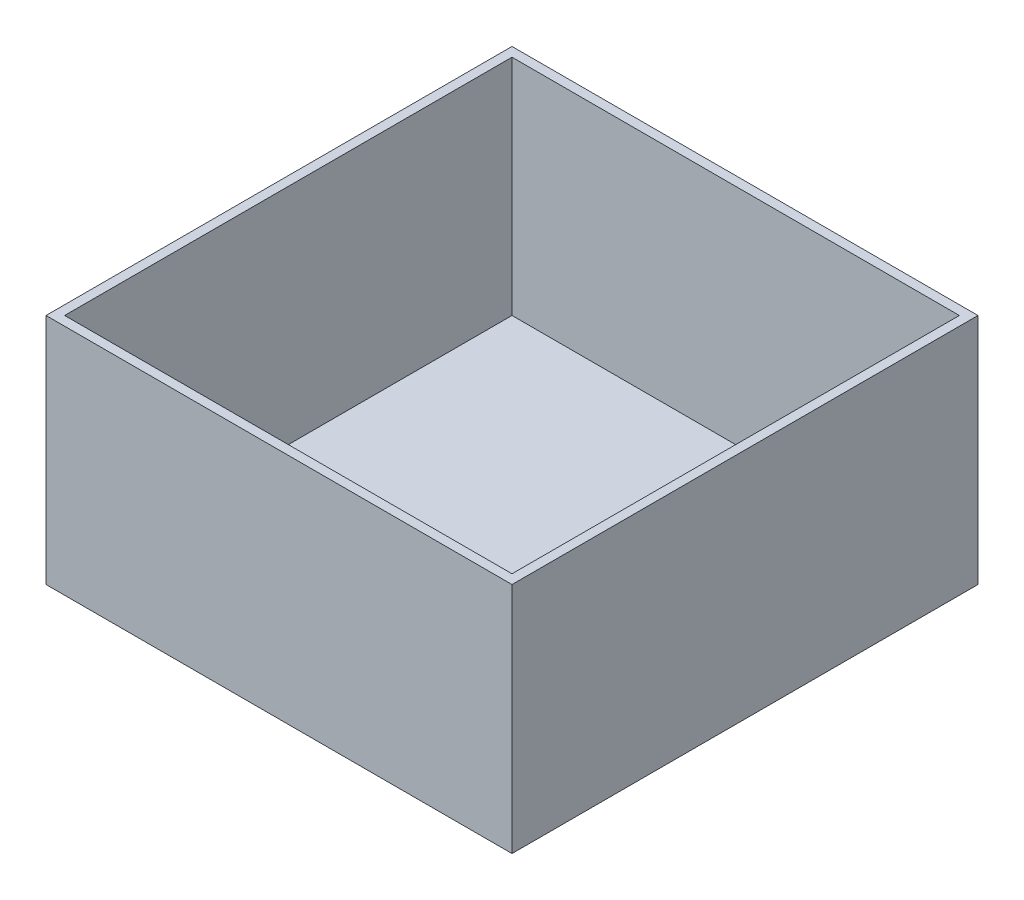
ISO-10303-21;
HEADER;
FILE_DESCRIPTION(('STEP AP214'),'2;1');
FILE_NAME('part.step','',(''),(''),'','','');
FILE_SCHEMA(('AUTOMOTIVE_DESIGN { 1 0 10303 214 1 1 1 1 }'));
ENDSEC;
DATA;
#1=APPLICATION_CONTEXT('core data for automotive mechanical design processes');
#2=APPLICATION_PROTOCOL_DEFINITION('international standard','automotive_design',2000,#1);
#3=PRODUCT_CONTEXT('',#1,'mechanical');
#4=PRODUCT('Part','Part','',(#3));
#5=PRODUCT_RELATED_PRODUCT_CATEGORY('part','',(#4));
#6=PRODUCT_DEFINITION_FORMATION('','',#4);
#7=PRODUCT_DEFINITION_CONTEXT('part definition',#1,'design');
#8=PRODUCT_DEFINITION('design','',#6,#7);
#9=PRODUCT_DEFINITION_SHAPE('','',#8);
#10=(LENGTH_UNIT() NAMED_UNIT(*) SI_UNIT(.MILLI.,.METRE.));
#11=(NAMED_UNIT(*) PLANE_ANGLE_UNIT() SI_UNIT($,.RADIAN.));
#12=(NAMED_UNIT(*) SI_UNIT($,.STERADIAN.) SOLID_ANGLE_UNIT());
#13=UNCERTAINTY_MEASURE_WITH_UNIT(LENGTH_MEASURE(1.E-05),#10,'distance_accuracy_value','');
#14=(GEOMETRIC_REPRESENTATION_CONTEXT(3) GLOBAL_UNCERTAINTY_ASSIGNED_CONTEXT((#13)) GLOBAL_UNIT_ASSIGNED_CONTEXT((#10,
#11,#12)) REPRESENTATION_CONTEXT('',''));
#15=CARTESIAN_POINT('',(0.,0.,0.));
#16=DIRECTION('',(0.,0.,1.));
#17=DIRECTION('',(1.,0.,0.));
#18=AXIS2_PLACEMENT_3D('',#15,#16,#17);
#19=CARTESIAN_POINT('',(-145.919437275,250.,-401.338562297017));
#20=DIRECTION('',(1.,0.,0.));
#21=DIRECTION('',(0.,0.,-1.));
#22=AXIS2_PLACEMENT_3D('',#19,#20,#21);
#23=PLANE('',#22);
#24=DIRECTION('',(0.,0.,1.));
#25=VECTOR('',#24,1.);
#26=CARTESIAN_POINT('',(-145.919437275,0.,-401.338562297017));
#27=LINE('',#26,#25);
#28=CARTESIAN_POINT('',(-145.919437275,0.,-401.338562297017));
#29=VERTEX_POINT('',#28);
#30=CARTESIAN_POINT('',(-145.919437274999,0.,98.6614377029827));
#31=VERTEX_POINT('',#30);
#32=EDGE_CURVE('E155',#29,#31,#27,.T.);
#33=ORIENTED_EDGE('',*,*,#32,.T.);
#34=DIRECTION('',(0.,-1.,0.));
#35=VECTOR('',#34,1.);
#36=CARTESIAN_POINT('',(-145.919437274999,250.,98.6614377029827));
#37=LINE('',#36,#35);
#38=CARTESIAN_POINT('',(-145.919437274999,250.,98.6614377029827));
#39=VERTEX_POINT('',#38);
#40=EDGE_CURVE('E11',#39,#31,#37,.T.);
#41=ORIENTED_EDGE('',*,*,#40,.F.);
#42=DIRECTION('',(0.,0.,1.));
#43=VECTOR('',#42,1.);
#44=CARTESIAN_POINT('',(-145.919437275,250.,-401.338562297017));
#45=LINE('',#44,#43);
#46=CARTESIAN_POINT('',(-145.919437275,250.,-401.338562297017));
#47=VERTEX_POINT('',#46);
#48=EDGE_CURVE('E148',#47,#39,#45,.T.);
#49=ORIENTED_EDGE('',*,*,#48,.F.);
#50=DIRECTION('',(0.,-1.,0.));
#51=VECTOR('',#50,1.);
#52=CARTESIAN_POINT('',(-145.919437275,250.,-401.338562297017));
#53=LINE('',#52,#51);
#54=EDGE_CURVE('E154',#47,#29,#53,.T.);
#55=ORIENTED_EDGE('',*,*,#54,.T.);
#56=EDGE_LOOP('',(#33,#41,#49,#55));
#57=FACE_BOUND('',#56,.T.);
#58=ADVANCED_FACE('F41',(#57),#23,.F.);
#59=CARTESIAN_POINT('',(-145.919437274999,250.,98.6614377029827));
#60=DIRECTION('',(0.,0.,-1.));
#61=DIRECTION('',(-1.,0.,0.));
#62=AXIS2_PLACEMENT_3D('',#59,#60,#61);
#63=PLANE('',#62);
#64=DIRECTION('',(1.,0.,0.));
#65=VECTOR('',#64,1.);
#66=CARTESIAN_POINT('',(-145.919437274999,0.,98.6614377029827));
#67=LINE('',#66,#65);
#68=CARTESIAN_POINT('',(354.080562725001,0.,98.6614377029827));
#69=VERTEX_POINT('',#68);
#70=EDGE_CURVE('E158',#31,#69,#67,.T.);
#71=ORIENTED_EDGE('',*,*,#70,.T.);
#72=DIRECTION('',(0.,-1.,0.));
#73=VECTOR('',#72,1.);
#74=CARTESIAN_POINT('',(354.080562725001,250.,98.6614377029827));
#75=LINE('',#74,#73);
#76=CARTESIAN_POINT('',(354.080562725001,250.,98.6614377029827));
#77=VERTEX_POINT('',#76);
#78=EDGE_CURVE('E48',#77,#69,#75,.T.);
#79=ORIENTED_EDGE('',*,*,#78,.F.);
#80=DIRECTION('',(1.,0.,0.));
#81=VECTOR('',#80,1.);
#82=CARTESIAN_POINT('',(-145.919437274999,250.,98.6614377029827));
#83=LINE('',#82,#81);
#84=EDGE_CURVE('E92',#39,#77,#83,.T.);
#85=ORIENTED_EDGE('',*,*,#84,.F.);
#86=ORIENTED_EDGE('',*,*,#40,.T.);
#87=EDGE_LOOP('',(#71,#79,#85,#86));
#88=FACE_BOUND('',#87,.T.);
#89=ADVANCED_FACE('F187',(#88),#63,.F.);
#90=CARTESIAN_POINT('',(354.080562725001,250.,-401.338562297017));
#91=DIRECTION('',(-1.,0.,0.));
#92=DIRECTION('',(0.,0.,1.));
#93=AXIS2_PLACEMENT_3D('',#90,#91,#92);
#94=PLANE('',#93);
#95=DIRECTION('',(0.,0.,-1.));
#96=VECTOR('',#95,1.);
#97=CARTESIAN_POINT('',(354.080562725001,0.,-401.338562297017));
#98=LINE('',#97,#96);
#99=CARTESIAN_POINT('',(354.080562725001,0.,-401.338562297017));
#100=VERTEX_POINT('',#99);
#101=EDGE_CURVE('E160',#69,#100,#98,.T.);
#102=ORIENTED_EDGE('',*,*,#101,.T.);
#103=DIRECTION('',(0.,-1.,0.));
#104=VECTOR('',#103,1.);
#105=CARTESIAN_POINT('',(354.080562725001,250.,-401.338562297017));
#106=LINE('',#105,#104);
#107=CARTESIAN_POINT('',(354.080562725001,250.,-401.338562297017));
#108=VERTEX_POINT('',#107);
#109=EDGE_CURVE('E164',#108,#100,#106,.T.);
#110=ORIENTED_EDGE('',*,*,#109,.F.);
#111=DIRECTION('',(0.,0.,-1.));
#112=VECTOR('',#111,1.);
#113=CARTESIAN_POINT('',(354.080562725001,250.,-401.338562297017));
#114=LINE('',#113,#112);
#115=EDGE_CURVE('E151',#77,#108,#114,.T.);
#116=ORIENTED_EDGE('',*,*,#115,.F.);
#117=ORIENTED_EDGE('',*,*,#78,.T.);
#118=EDGE_LOOP('',(#102,#110,#116,#117));
#119=FACE_BOUND('',#118,.T.);
#120=ADVANCED_FACE('F169',(#119),#94,.F.);
#121=CARTESIAN_POINT('',(-145.919437275,250.,-401.338562297017));
#122=DIRECTION('',(0.,0.,1.));
#123=DIRECTION('',(1.,0.,0.));
#124=AXIS2_PLACEMENT_3D('',#121,#122,#123);
#125=PLANE('',#124);
#126=DIRECTION('',(-1.,0.,0.));
#127=VECTOR('',#126,1.);
#128=CARTESIAN_POINT('',(-145.919437275,0.,-401.338562297017));
#129=LINE('',#128,#127);
#130=EDGE_CURVE('E85',#100,#29,#129,.T.);
#131=ORIENTED_EDGE('',*,*,#130,.T.);
#132=ORIENTED_EDGE('',*,*,#54,.F.);
#133=DIRECTION('',(-1.,0.,0.));
#134=VECTOR('',#133,1.);
#135=CARTESIAN_POINT('',(-145.919437275,250.,-401.338562297017));
#136=LINE('',#135,#134);
#137=EDGE_CURVE('E64',#108,#47,#136,.T.);
#138=ORIENTED_EDGE('',*,*,#137,.F.);
#139=ORIENTED_EDGE('',*,*,#109,.T.);
#140=EDGE_LOOP('',(#131,#132,#138,#139));
#141=FACE_BOUND('',#140,.T.);
#142=ADVANCED_FACE('F177',(#141),#125,.F.);
#143=CARTESIAN_POINT('',(0.,250.,0.));
#144=DIRECTION('',(0.,1.,0.));
#145=DIRECTION('',(0.,0.,1.));
#146=AXIS2_PLACEMENT_3D('',#143,#144,#145);
#147=PLANE('',#146);
#148=DIRECTION('',(0.,0.,1.));
#149=VECTOR('',#148,1.);
#150=CARTESIAN_POINT('',(-135.919437275,250.,-401.338562297017));
#151=LINE('',#150,#149);
#152=CARTESIAN_POINT('',(-135.919437275,250.,-391.338562297017));
#153=VERTEX_POINT('',#152);
#154=CARTESIAN_POINT('',(-135.919437274999,250.,88.6614377029827));
#155=VERTEX_POINT('',#154);
#156=EDGE_CURVE('E137',#153,#155,#151,.T.);
#157=ORIENTED_EDGE('',*,*,#156,.F.);
#158=DIRECTION('',(-1.,0.,0.));
#159=VECTOR('',#158,1.);
#160=CARTESIAN_POINT('',(-145.919437275,250.,-391.338562297017));
#161=LINE('',#160,#159);
#162=CARTESIAN_POINT('',(344.080562725001,250.,-391.338562297017));
#163=VERTEX_POINT('',#162);
#164=EDGE_CURVE('E146',#163,#153,#161,.T.);
#165=ORIENTED_EDGE('',*,*,#164,.F.);
#166=DIRECTION('',(0.,0.,-1.));
#167=VECTOR('',#166,1.);
#168=CARTESIAN_POINT('',(344.080562725001,250.,-401.338562297017));
#169=LINE('',#168,#167);
#170=CARTESIAN_POINT('',(344.080562725001,250.,88.6614377029827));
#171=VERTEX_POINT('',#170);
#172=EDGE_CURVE('E144',#171,#163,#169,.T.);
#173=ORIENTED_EDGE('',*,*,#172,.F.);
#174=DIRECTION('',(1.,0.,0.));
#175=VECTOR('',#174,1.);
#176=CARTESIAN_POINT('',(-145.919437274999,250.,88.6614377029827));
#177=LINE('',#176,#175);
#178=EDGE_CURVE('E129',#155,#171,#177,.T.);
#179=ORIENTED_EDGE('',*,*,#178,.F.);
#180=EDGE_LOOP('',(#157,#165,#173,#179));
#181=FACE_BOUND('',#180,.T.);
#182=ORIENTED_EDGE('',*,*,#48,.T.);
#183=ORIENTED_EDGE('',*,*,#84,.T.);
#184=ORIENTED_EDGE('',*,*,#115,.T.);
#185=ORIENTED_EDGE('',*,*,#137,.T.);
#186=EDGE_LOOP('',(#182,#183,#184,#185));
#187=FACE_BOUND('',#186,.T.);
#188=ADVANCED_FACE('F179',(#181,#187),#147,.T.);
#189=CARTESIAN_POINT('',(0.,0.,0.));
#190=DIRECTION('',(0.,1.,0.));
#191=DIRECTION('',(0.,0.,1.));
#192=AXIS2_PLACEMENT_3D('',#189,#190,#191);
#193=PLANE('',#192);
#194=ORIENTED_EDGE('',*,*,#32,.F.);
#195=ORIENTED_EDGE('',*,*,#130,.F.);
#196=ORIENTED_EDGE('',*,*,#101,.F.);
#197=ORIENTED_EDGE('',*,*,#70,.F.);
#198=EDGE_LOOP('',(#194,#195,#196,#197));
#199=FACE_BOUND('',#198,.T.);
#200=ADVANCED_FACE('F173',(#199),#193,.F.);
#201=CARTESIAN_POINT('',(-135.919437275,250.,-401.338562297017));
#202=DIRECTION('',(1.,0.,0.));
#203=DIRECTION('',(0.,0.,-1.));
#204=AXIS2_PLACEMENT_3D('',#201,#202,#203);
#205=PLANE('',#204);
#206=DIRECTION('',(0.,0.,1.));
#207=VECTOR('',#206,1.);
#208=CARTESIAN_POINT('',(-135.919437275,10.,-401.338562297017));
#209=LINE('',#208,#207);
#210=CARTESIAN_POINT('',(-135.919437275,10.,-391.338562297017));
#211=VERTEX_POINT('',#210);
#212=CARTESIAN_POINT('',(-135.919437274999,10.,88.6614377029827));
#213=VERTEX_POINT('',#212);
#214=EDGE_CURVE('E120',#211,#213,#209,.T.);
#215=ORIENTED_EDGE('',*,*,#214,.F.);
#216=DIRECTION('',(0.,-1.,0.));
#217=VECTOR('',#216,1.);
#218=CARTESIAN_POINT('',(-135.919437275,250.,-391.338562297017));
#219=LINE('',#218,#217);
#220=EDGE_CURVE('E140',#153,#211,#219,.T.);
#221=ORIENTED_EDGE('',*,*,#220,.F.);
#222=ORIENTED_EDGE('',*,*,#156,.T.);
#223=DIRECTION('',(0.,-1.,0.));
#224=VECTOR('',#223,1.);
#225=CARTESIAN_POINT('',(-135.919437274999,250.,88.6614377029827));
#226=LINE('',#225,#224);
#227=EDGE_CURVE('E132',#155,#213,#226,.T.);
#228=ORIENTED_EDGE('',*,*,#227,.T.);
#229=EDGE_LOOP('',(#215,#221,#222,#228));
#230=FACE_BOUND('',#229,.T.);
#231=ADVANCED_FACE('F216',(#230),#205,.T.);
#232=CARTESIAN_POINT('',(-145.919437274999,250.,88.6614377029827));
#233=DIRECTION('',(0.,0.,-1.));
#234=DIRECTION('',(-1.,0.,0.));
#235=AXIS2_PLACEMENT_3D('',#232,#233,#234);
#236=PLANE('',#235);
#237=DIRECTION('',(1.,0.,0.));
#238=VECTOR('',#237,1.);
#239=CARTESIAN_POINT('',(-145.919437274999,10.,88.6614377029827));
#240=LINE('',#239,#238);
#241=CARTESIAN_POINT('',(344.080562725001,10.,88.6614377029827));
#242=VERTEX_POINT('',#241);
#243=EDGE_CURVE('E114',#213,#242,#240,.T.);
#244=ORIENTED_EDGE('',*,*,#243,.F.);
#245=ORIENTED_EDGE('',*,*,#227,.F.);
#246=ORIENTED_EDGE('',*,*,#178,.T.);
#247=DIRECTION('',(0.,-1.,0.));
#248=VECTOR('',#247,1.);
#249=CARTESIAN_POINT('',(344.080562725001,250.,88.6614377029826));
#250=LINE('',#249,#248);
#251=EDGE_CURVE('E126',#171,#242,#250,.T.);
#252=ORIENTED_EDGE('',*,*,#251,.T.);
#253=EDGE_LOOP('',(#244,#245,#246,#252));
#254=FACE_BOUND('',#253,.T.);
#255=ADVANCED_FACE('F127',(#254),#236,.T.);
#256=CARTESIAN_POINT('',(344.080562725001,250.,-401.338562297017));
#257=DIRECTION('',(-1.,0.,0.));
#258=DIRECTION('',(0.,0.,1.));
#259=AXIS2_PLACEMENT_3D('',#256,#257,#258);
#260=PLANE('',#259);
#261=DIRECTION('',(0.,0.,-1.));
#262=VECTOR('',#261,1.);
#263=CARTESIAN_POINT('',(344.080562725001,10.,-401.338562297017));
#264=LINE('',#263,#262);
#265=CARTESIAN_POINT('',(344.080562725001,10.,-391.338562297017));
#266=VERTEX_POINT('',#265);
#267=EDGE_CURVE('E118',#242,#266,#264,.T.);
#268=ORIENTED_EDGE('',*,*,#267,.F.);
#269=ORIENTED_EDGE('',*,*,#251,.F.);
#270=ORIENTED_EDGE('',*,*,#172,.T.);
#271=DIRECTION('',(0.,-1.,0.));
#272=VECTOR('',#271,1.);
#273=CARTESIAN_POINT('',(344.080562725001,250.,-391.338562297017));
#274=LINE('',#273,#272);
#275=EDGE_CURVE('E55',#163,#266,#274,.T.);
#276=ORIENTED_EDGE('',*,*,#275,.T.);
#277=EDGE_LOOP('',(#268,#269,#270,#276));
#278=FACE_BOUND('',#277,.T.);
#279=ADVANCED_FACE('F134',(#278),#260,.T.);
#280=CARTESIAN_POINT('',(-145.919437275,250.,-391.338562297017));
#281=DIRECTION('',(0.,0.,1.));
#282=DIRECTION('',(1.,0.,0.));
#283=AXIS2_PLACEMENT_3D('',#280,#281,#282);
#284=PLANE('',#283);
#285=DIRECTION('',(-1.,0.,0.));
#286=VECTOR('',#285,1.);
#287=CARTESIAN_POINT('',(-145.919437275,10.,-391.338562297017));
#288=LINE('',#287,#286);
#289=EDGE_CURVE('E135',#266,#211,#288,.T.);
#290=ORIENTED_EDGE('',*,*,#289,.F.);
#291=ORIENTED_EDGE('',*,*,#275,.F.);
#292=ORIENTED_EDGE('',*,*,#164,.T.);
#293=ORIENTED_EDGE('',*,*,#220,.T.);
#294=EDGE_LOOP('',(#290,#291,#292,#293));
#295=FACE_BOUND('',#294,.T.);
#296=ADVANCED_FACE('F251',(#295),#284,.T.);
#297=CARTESIAN_POINT('',(0.,10.,0.));
#298=DIRECTION('',(0.,1.,0.));
#299=DIRECTION('',(0.,0.,1.));
#300=AXIS2_PLACEMENT_3D('',#297,#298,#299);
#301=PLANE('',#300);
#302=ORIENTED_EDGE('',*,*,#214,.T.);
#303=ORIENTED_EDGE('',*,*,#243,.T.);
#304=ORIENTED_EDGE('',*,*,#267,.T.);
#305=ORIENTED_EDGE('',*,*,#289,.T.);
#306=EDGE_LOOP('',(#302,#303,#304,#305));
#307=FACE_BOUND('',#306,.T.);
#308=ADVANCED_FACE('F116',(#307),#301,.T.);
#309=CLOSED_SHELL('',(#58,#89,#120,#142,#188,#200,#231,#255,#279,#296,#308));
#310=MANIFOLD_SOLID_BREP('B2',#309);
#311=ADVANCED_BREP_SHAPE_REPRESENTATION('',(#18,#310),#14);
#312=SHAPE_DEFINITION_REPRESENTATION(#9,#311);
ENDSEC;
END-ISO-10303-21;
